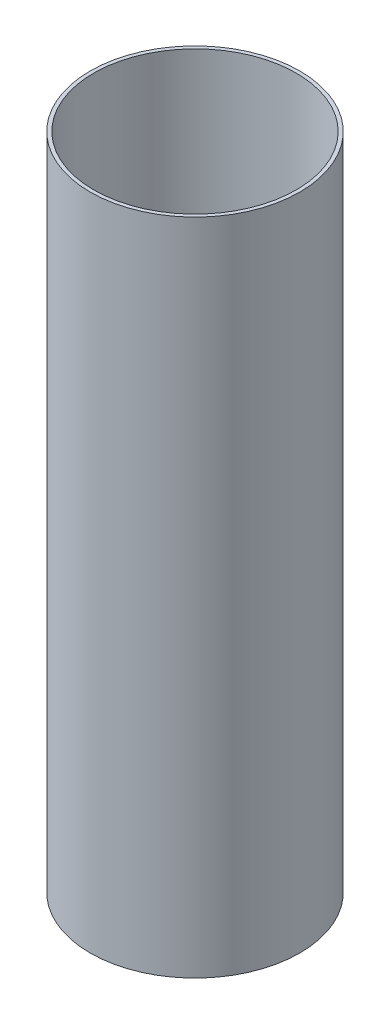
ISO-10303-21;
HEADER;
FILE_DESCRIPTION(('STEP AP214'),'2;1');
FILE_NAME('part.step','',(''),(''),'','','');
FILE_SCHEMA(('AUTOMOTIVE_DESIGN { 1 0 10303 214 1 1 1 1 }'));
ENDSEC;
DATA;
#1=APPLICATION_CONTEXT('core data for automotive mechanical design processes');
#2=APPLICATION_PROTOCOL_DEFINITION('international standard','automotive_design',2000,#1);
#3=PRODUCT_CONTEXT('',#1,'mechanical');
#4=PRODUCT('Part','Part','',(#3));
#5=PRODUCT_RELATED_PRODUCT_CATEGORY('part','',(#4));
#6=PRODUCT_DEFINITION_FORMATION('','',#4);
#7=PRODUCT_DEFINITION_CONTEXT('part definition',#1,'design');
#8=PRODUCT_DEFINITION('design','',#6,#7);
#9=PRODUCT_DEFINITION_SHAPE('','',#8);
#10=(LENGTH_UNIT() NAMED_UNIT(*) SI_UNIT(.MILLI.,.METRE.));
#11=(NAMED_UNIT(*) PLANE_ANGLE_UNIT() SI_UNIT($,.RADIAN.));
#12=(NAMED_UNIT(*) SI_UNIT($,.STERADIAN.) SOLID_ANGLE_UNIT());
#13=UNCERTAINTY_MEASURE_WITH_UNIT(LENGTH_MEASURE(1.E-05),#10,'distance_accuracy_value','');
#14=(GEOMETRIC_REPRESENTATION_CONTEXT(3) GLOBAL_UNCERTAINTY_ASSIGNED_CONTEXT((#13)) GLOBAL_UNIT_ASSIGNED_CONTEXT((#10,
#11,#12)) REPRESENTATION_CONTEXT('',''));
#15=CARTESIAN_POINT('',(0.,0.,0.));
#16=DIRECTION('',(0.,0.,1.));
#17=DIRECTION('',(1.,0.,0.));
#18=AXIS2_PLACEMENT_3D('',#15,#16,#17);
#19=CARTESIAN_POINT('',(0.,55.,0.));
#20=DIRECTION('',(0.,1.,0.));
#21=DIRECTION('',(0.,0.,1.));
#22=AXIS2_PLACEMENT_3D('',#19,#20,#21);
#23=PLANE('',#22);
#24=CARTESIAN_POINT('',(0.,55.,0.));
#25=DIRECTION('',(0.,1.,0.));
#26=DIRECTION('',(0.,0.,1.));
#27=AXIS2_PLACEMENT_3D('',#24,#25,#26);
#28=CIRCLE('',#27,17.5);
#29=CARTESIAN_POINT('',(0.,55.,17.5));
#30=VERTEX_POINT('',#29);
#31=EDGE_CURVE('E10',#30,#30,#28,.T.);
#32=ORIENTED_EDGE('',*,*,#31,.T.);
#33=EDGE_LOOP('',(#32));
#34=FACE_BOUND('',#33,.T.);
#35=CARTESIAN_POINT('',(0.,55.,0.));
#36=DIRECTION('',(0.,1.,0.));
#37=DIRECTION('',(0.,0.,1.));
#38=AXIS2_PLACEMENT_3D('',#35,#36,#37);
#39=CIRCLE('',#38,16.9);
#40=CARTESIAN_POINT('',(0.,55.,16.9));
#41=VERTEX_POINT('',#40);
#42=EDGE_CURVE('E54',#41,#41,#39,.T.);
#43=ORIENTED_EDGE('',*,*,#42,.F.);
#44=EDGE_LOOP('',(#43));
#45=FACE_BOUND('',#44,.T.);
#46=ADVANCED_FACE('F41',(#34,#45),#23,.T.);
#47=CARTESIAN_POINT('',(0.,-55.,0.));
#48=DIRECTION('',(0.,1.,0.));
#49=DIRECTION('',(0.,0.,1.));
#50=AXIS2_PLACEMENT_3D('',#47,#48,#49);
#51=PLANE('',#50);
#52=CARTESIAN_POINT('',(0.,-55.,0.));
#53=DIRECTION('',(0.,1.,0.));
#54=DIRECTION('',(0.,0.,1.));
#55=AXIS2_PLACEMENT_3D('',#52,#53,#54);
#56=CIRCLE('',#55,17.5);
#57=CARTESIAN_POINT('',(0.,-55.,17.5));
#58=VERTEX_POINT('',#57);
#59=EDGE_CURVE('E45',#58,#58,#56,.T.);
#60=ORIENTED_EDGE('',*,*,#59,.F.);
#61=EDGE_LOOP('',(#60));
#62=FACE_BOUND('',#61,.T.);
#63=CARTESIAN_POINT('',(0.,-55.,0.));
#64=DIRECTION('',(0.,1.,0.));
#65=DIRECTION('',(0.,0.,1.));
#66=AXIS2_PLACEMENT_3D('',#63,#64,#65);
#67=CIRCLE('',#66,16.9);
#68=CARTESIAN_POINT('',(0.,-55.,16.9));
#69=VERTEX_POINT('',#68);
#70=EDGE_CURVE('E56',#69,#69,#67,.T.);
#71=ORIENTED_EDGE('',*,*,#70,.T.);
#72=EDGE_LOOP('',(#71));
#73=FACE_BOUND('',#72,.T.);
#74=ADVANCED_FACE('F68',(#62,#73),#51,.F.);
#75=CARTESIAN_POINT('',(0.,55.,0.));
#76=DIRECTION('',(0.,-1.,0.));
#77=DIRECTION('',(0.,0.,-1.));
#78=AXIS2_PLACEMENT_3D('',#75,#76,#77);
#79=CYLINDRICAL_SURFACE('',#78,17.5);
#80=ORIENTED_EDGE('',*,*,#31,.F.);
#81=EDGE_LOOP('',(#80));
#82=FACE_BOUND('',#81,.T.);
#83=ORIENTED_EDGE('',*,*,#59,.T.);
#84=EDGE_LOOP('',(#83));
#85=FACE_BOUND('',#84,.T.);
#86=ADVANCED_FACE('F43',(#82,#85),#79,.T.);
#87=CARTESIAN_POINT('',(0.,55.,0.));
#88=DIRECTION('',(0.,-1.,0.));
#89=DIRECTION('',(0.,0.,-1.));
#90=AXIS2_PLACEMENT_3D('',#87,#88,#89);
#91=CYLINDRICAL_SURFACE('',#90,16.9);
#92=ORIENTED_EDGE('',*,*,#42,.T.);
#93=EDGE_LOOP('',(#92));
#94=FACE_BOUND('',#93,.T.);
#95=ORIENTED_EDGE('',*,*,#70,.F.);
#96=EDGE_LOOP('',(#95));
#97=FACE_BOUND('',#96,.T.);
#98=ADVANCED_FACE('F64',(#94,#97),#91,.F.);
#99=CLOSED_SHELL('',(#46,#74,#86,#98));
#100=MANIFOLD_SOLID_BREP('B2',#99);
#101=ADVANCED_BREP_SHAPE_REPRESENTATION('',(#18,#100),#14);
#102=SHAPE_DEFINITION_REPRESENTATION(#9,#101);
ENDSEC;
END-ISO-10303-21;
